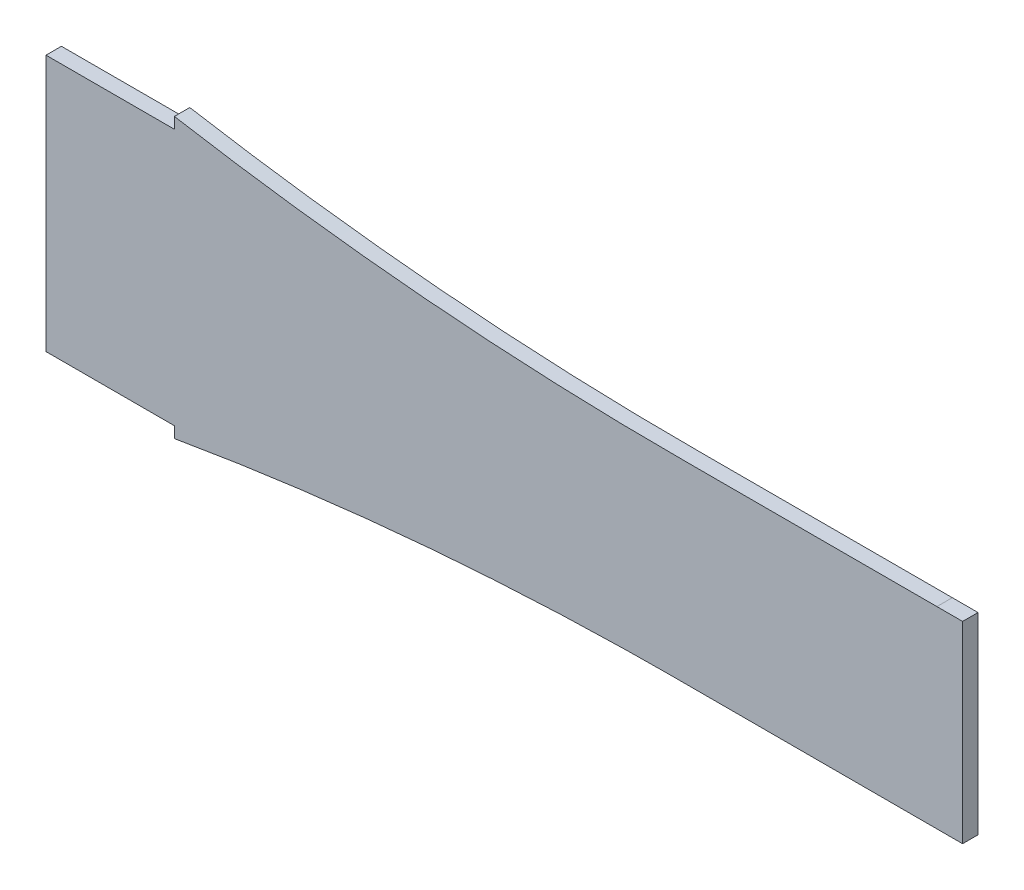
ISO-10303-21;
HEADER;
FILE_DESCRIPTION(('STEP AP214'),'2;1');
FILE_NAME('part.step','',(''),(''),'','','');
FILE_SCHEMA(('AUTOMOTIVE_DESIGN { 1 0 10303 214 1 1 1 1 }'));
ENDSEC;
DATA;
#1=APPLICATION_CONTEXT('core data for automotive mechanical design processes');
#2=APPLICATION_PROTOCOL_DEFINITION('international standard','automotive_design',2000,#1);
#3=PRODUCT_CONTEXT('',#1,'mechanical');
#4=PRODUCT('Part','Part','',(#3));
#5=PRODUCT_RELATED_PRODUCT_CATEGORY('part','',(#4));
#6=PRODUCT_DEFINITION_FORMATION('','',#4);
#7=PRODUCT_DEFINITION_CONTEXT('part definition',#1,'design');
#8=PRODUCT_DEFINITION('design','',#6,#7);
#9=PRODUCT_DEFINITION_SHAPE('','',#8);
#10=(LENGTH_UNIT() NAMED_UNIT(*) SI_UNIT(.MILLI.,.METRE.));
#11=(NAMED_UNIT(*) PLANE_ANGLE_UNIT() SI_UNIT($,.RADIAN.));
#12=(NAMED_UNIT(*) SI_UNIT($,.STERADIAN.) SOLID_ANGLE_UNIT());
#13=UNCERTAINTY_MEASURE_WITH_UNIT(LENGTH_MEASURE(1.E-05),#10,'distance_accuracy_value','');
#14=(GEOMETRIC_REPRESENTATION_CONTEXT(3) GLOBAL_UNCERTAINTY_ASSIGNED_CONTEXT((#13)) GLOBAL_UNIT_ASSIGNED_CONTEXT((#10,
#11,#12)) REPRESENTATION_CONTEXT('',''));
#15=CARTESIAN_POINT('',(0.,0.,0.));
#16=DIRECTION('',(0.,0.,1.));
#17=DIRECTION('',(1.,0.,0.));
#18=AXIS2_PLACEMENT_3D('',#15,#16,#17);
#19=CARTESIAN_POINT('',(141.101357242702,0.,-0.6));
#20=DIRECTION('',(1.,0.,0.));
#21=DIRECTION('',(0.,0.,-1.));
#22=AXIS2_PLACEMENT_3D('',#19,#20,#21);
#23=PLANE('',#22);
#24=DIRECTION('',(0.,0.,1.));
#25=VECTOR('',#24,1.);
#26=CARTESIAN_POINT('',(141.101357242702,-4.86658289994277,-0.6));
#27=LINE('',#26,#25);
#28=CARTESIAN_POINT('',(141.101357242702,-4.86658289994277,-0.6));
#29=VERTEX_POINT('',#28);
#30=CARTESIAN_POINT('',(141.101357242702,-4.86658289994277,0.6));
#31=VERTEX_POINT('',#30);
#32=EDGE_CURVE('E39',#29,#31,#27,.T.);
#33=ORIENTED_EDGE('',*,*,#32,.T.);
#34=DIRECTION('',(0.,1.,0.));
#35=VECTOR('',#34,1.);
#36=CARTESIAN_POINT('',(141.101357242702,0.,0.6));
#37=LINE('',#36,#35);
#38=CARTESIAN_POINT('',(141.101357242702,-4.00000000000001,0.6));
#39=VERTEX_POINT('',#38);
#40=EDGE_CURVE('E116',#31,#39,#37,.T.);
#41=ORIENTED_EDGE('',*,*,#40,.T.);
#42=DIRECTION('',(0.,0.,1.));
#43=VECTOR('',#42,1.);
#44=CARTESIAN_POINT('',(141.101357242702,-4.00000000000001,-0.6));
#45=LINE('',#44,#43);
#46=CARTESIAN_POINT('',(141.101357242702,-4.00000000000001,-0.6));
#47=VERTEX_POINT('',#46);
#48=EDGE_CURVE('E11',#47,#39,#45,.T.);
#49=ORIENTED_EDGE('',*,*,#48,.F.);
#50=DIRECTION('',(0.,1.,0.));
#51=VECTOR('',#50,1.);
#52=CARTESIAN_POINT('',(141.101357242702,0.,-0.6));
#53=LINE('',#52,#51);
#54=EDGE_CURVE('E52',#29,#47,#53,.T.);
#55=ORIENTED_EDGE('',*,*,#54,.F.);
#56=EDGE_LOOP('',(#33,#41,#49,#55));
#57=FACE_BOUND('',#56,.T.);
#58=ADVANCED_FACE('F34',(#57),#23,.F.);
#59=CARTESIAN_POINT('',(0.,-4.,-0.6));
#60=DIRECTION('',(0.,-1.,0.));
#61=DIRECTION('',(1.,0.,0.));
#62=AXIS2_PLACEMENT_3D('',#59,#60,#61);
#63=PLANE('',#62);
#64=ORIENTED_EDGE('',*,*,#48,.T.);
#65=DIRECTION('',(1.,0.,0.));
#66=VECTOR('',#65,1.);
#67=CARTESIAN_POINT('',(0.,-4.,0.6));
#68=LINE('',#67,#66);
#69=CARTESIAN_POINT('',(131.101357242702,-4.00000000000001,0.6));
#70=VERTEX_POINT('',#69);
#71=EDGE_CURVE('E132',#70,#39,#68,.T.);
#72=ORIENTED_EDGE('',*,*,#71,.F.);
#73=DIRECTION('',(0.,0.,1.));
#74=VECTOR('',#73,1.);
#75=CARTESIAN_POINT('',(131.101357242702,-4.00000000000001,-0.6));
#76=LINE('',#75,#74);
#77=CARTESIAN_POINT('',(131.101357242702,-4.00000000000001,-0.6));
#78=VERTEX_POINT('',#77);
#79=EDGE_CURVE('E44',#78,#70,#76,.T.);
#80=ORIENTED_EDGE('',*,*,#79,.F.);
#81=DIRECTION('',(1.,0.,0.));
#82=VECTOR('',#81,1.);
#83=CARTESIAN_POINT('',(0.,-4.,-0.6));
#84=LINE('',#83,#82);
#85=EDGE_CURVE('E120',#78,#47,#84,.T.);
#86=ORIENTED_EDGE('',*,*,#85,.T.);
#87=EDGE_LOOP('',(#64,#72,#80,#86));
#88=FACE_BOUND('',#87,.T.);
#89=ADVANCED_FACE('F211',(#88),#63,.T.);
#90=CARTESIAN_POINT('',(131.101357242702,0.,-0.6));
#91=DIRECTION('',(1.,0.,0.));
#92=DIRECTION('',(0.,0.,-1.));
#93=AXIS2_PLACEMENT_3D('',#90,#91,#92);
#94=PLANE('',#93);
#95=ORIENTED_EDGE('',*,*,#79,.T.);
#96=DIRECTION('',(0.,1.,0.));
#97=VECTOR('',#96,1.);
#98=CARTESIAN_POINT('',(131.101357242702,0.,0.6));
#99=LINE('',#98,#97);
#100=CARTESIAN_POINT('',(131.101357242702,16.,0.6));
#101=VERTEX_POINT('',#100);
#102=EDGE_CURVE('E142',#70,#101,#99,.T.);
#103=ORIENTED_EDGE('',*,*,#102,.T.);
#104=DIRECTION('',(0.,0.,1.));
#105=VECTOR('',#104,1.);
#106=CARTESIAN_POINT('',(131.101357242702,16.,-0.6));
#107=LINE('',#106,#105);
#108=CARTESIAN_POINT('',(131.101357242702,16.,-0.6));
#109=VERTEX_POINT('',#108);
#110=EDGE_CURVE('E227',#109,#101,#107,.T.);
#111=ORIENTED_EDGE('',*,*,#110,.F.);
#112=DIRECTION('',(0.,1.,0.));
#113=VECTOR('',#112,1.);
#114=CARTESIAN_POINT('',(131.101357242702,0.,-0.6));
#115=LINE('',#114,#113);
#116=EDGE_CURVE('E256',#78,#109,#115,.T.);
#117=ORIENTED_EDGE('',*,*,#116,.F.);
#118=EDGE_LOOP('',(#95,#103,#111,#117));
#119=FACE_BOUND('',#118,.T.);
#120=ADVANCED_FACE('F215',(#119),#94,.F.);
#121=CARTESIAN_POINT('',(0.,16.0000000000001,-0.6));
#122=DIRECTION('',(0.,-1.,0.));
#123=DIRECTION('',(1.,0.,0.));
#124=AXIS2_PLACEMENT_3D('',#121,#122,#123);
#125=PLANE('',#124);
#126=ORIENTED_EDGE('',*,*,#110,.T.);
#127=DIRECTION('',(1.,0.,0.));
#128=VECTOR('',#127,1.);
#129=CARTESIAN_POINT('',(0.,16.0000000000001,0.6));
#130=LINE('',#129,#128);
#131=CARTESIAN_POINT('',(141.101357242702,16.,0.6));
#132=VERTEX_POINT('',#131);
#133=EDGE_CURVE('E136',#101,#132,#130,.T.);
#134=ORIENTED_EDGE('',*,*,#133,.T.);
#135=DIRECTION('',(0.,0.,1.));
#136=VECTOR('',#135,1.);
#137=CARTESIAN_POINT('',(141.101357242702,16.,-0.6));
#138=LINE('',#137,#136);
#139=CARTESIAN_POINT('',(141.101357242702,16.,-0.6));
#140=VERTEX_POINT('',#139);
#141=EDGE_CURVE('E225',#140,#132,#138,.T.);
#142=ORIENTED_EDGE('',*,*,#141,.F.);
#143=DIRECTION('',(1.,0.,0.));
#144=VECTOR('',#143,1.);
#145=CARTESIAN_POINT('',(0.,16.0000000000001,-0.6));
#146=LINE('',#145,#144);
#147=EDGE_CURVE('E183',#109,#140,#146,.T.);
#148=ORIENTED_EDGE('',*,*,#147,.F.);
#149=EDGE_LOOP('',(#126,#134,#142,#148));
#150=FACE_BOUND('',#149,.T.);
#151=ADVANCED_FACE('F218',(#150),#125,.F.);
#152=ORIENTED_EDGE('',*,*,#141,.T.);
#153=CARTESIAN_POINT('',(141.101357242702,16.8665829030283,0.6));
#154=VERTEX_POINT('',#153);
#155=EDGE_CURVE('E134',#132,#154,#37,.T.);
#156=ORIENTED_EDGE('',*,*,#155,.T.);
#157=DIRECTION('',(0.,0.,1.));
#158=VECTOR('',#157,1.);
#159=CARTESIAN_POINT('',(141.101357242702,16.8665829030283,-0.6));
#160=LINE('',#159,#158);
#161=CARTESIAN_POINT('',(141.101357242702,16.8665829030283,-0.6));
#162=VERTEX_POINT('',#161);
#163=EDGE_CURVE('E228',#162,#154,#160,.T.);
#164=ORIENTED_EDGE('',*,*,#163,.F.);
#165=EDGE_CURVE('E163',#140,#162,#53,.T.);
#166=ORIENTED_EDGE('',*,*,#165,.F.);
#167=EDGE_LOOP('',(#152,#156,#164,#166));
#168=FACE_BOUND('',#167,.T.);
#169=ADVANCED_FACE('F194',(#168),#23,.F.);
#170=CARTESIAN_POINT('',(200.50370257032,13.5,-0.6));
#171=CARTESIAN_POINT('',(199.074917607863,13.5,-0.6));
#172=CARTESIAN_POINT('',(196.922682113011,13.4999999880973,-0.6));
#173=CARTESIAN_POINT('',(194.089266991205,13.5000000198378,-0.6));
#174=CARTESIAN_POINT('',(191.634138001622,13.4999999246163,-0.6));
#175=CARTESIAN_POINT('',(189.047662173666,13.5000002816969,-0.6));
#176=CARTESIAN_POINT('',(185.720042456999,13.4999985042292,-0.6));
#177=CARTESIAN_POINT('',(183.067579699138,13.5000093436081,-0.6));
#178=CARTESIAN_POINT('',(180.929013683632,13.4999840226286,-0.6));
#179=CARTESIAN_POINT('',(179.048732059276,13.5000865206204,-0.6));
#180=CARTESIAN_POINT('',(176.736526724022,13.5231044209523,-0.6));
#181=CARTESIAN_POINT('',(174.091882285485,13.5803475263092,-0.6));
#182=CARTESIAN_POINT('',(171.527736211095,13.6658215283123,-0.6));
#183=CARTESIAN_POINT('',(169.025206506323,13.7762859464122,-0.6));
#184=CARTESIAN_POINT('',(165.740597936394,13.9551698057802,-0.6));
#185=CARTESIAN_POINT('',(161.709086389879,14.2398546582152,-0.6));
#186=CARTESIAN_POINT('',(156.900354591833,14.6803919269567,-0.6));
#187=CARTESIAN_POINT('',(152.026473921235,15.2320423252698,-0.6));
#188=CARTESIAN_POINT('',(147.014900529943,15.9033837676482,-0.6));
#189=CARTESIAN_POINT('',(141.648285626768,16.7493721624977,-0.6));
#190=CARTESIAN_POINT('',(135.852117078069,17.8087694831889,-0.6));
#191=CARTESIAN_POINT('',(127.954832765805,19.4662144414581,-0.6));
#192=CARTESIAN_POINT('',(117.662597645174,22.0526471758129,-0.6));
#193=CARTESIAN_POINT('',(105.095697041218,25.988020630968,-0.6));
#194=CARTESIAN_POINT('',(94.8315928138357,29.8422023096934,-0.6));
#195=CARTESIAN_POINT('',(87.0594711772737,33.1900131616436,-0.6));
#196=CARTESIAN_POINT('',(79.3240610108562,36.4197847788014,-0.6));
#197=CARTESIAN_POINT('',(69.5591399402608,40.2855929965504,-0.6));
#198=CARTESIAN_POINT('',(57.6651955167104,44.6374779961789,-0.6));
#199=CARTESIAN_POINT('',(45.6694197162006,48.6476407813243,-0.6));
#200=CARTESIAN_POINT('',(29.5187149632974,53.5135271149481,-0.6));
#201=CARTESIAN_POINT('',(9.05694216564289,58.6198395024492,-0.6));
#202=CARTESIAN_POINT('',(-15.8792995780897,62.9176069243505,-0.6));
#203=CARTESIAN_POINT('',(-41.0871610835406,65.0643210620624,-0.6));
#204=CARTESIAN_POINT('',(-66.3794591406682,64.680911269362,-0.6));
#205=CARTESIAN_POINT('',(-91.4465280842014,61.3301117669268,-0.6));
#206=CARTESIAN_POINT('',(-111.745791670528,55.6594945291713,-0.6));
#207=CARTESIAN_POINT('',(-127.235680387522,49.126071695585,-0.6));
#208=CARTESIAN_POINT('',(-138.327528426005,43.1510553943047,-0.6));
#209=CARTESIAN_POINT('',(-148.698447894915,36.0118180282978,-0.6));
#210=CARTESIAN_POINT('',(-158.027199119519,27.5945918197225,-0.6));
#211=CARTESIAN_POINT('',(-164.496183458254,19.3622606803757,-0.6));
#212=CARTESIAN_POINT('',(-167.653921417957,12.8663282133976,-0.6));
#213=CARTESIAN_POINT('',(-168.768877649743,8.95280335393217,-0.6));
#214=CARTESIAN_POINT('',(-169.,6.98920546303122,-0.6));
#215=CARTESIAN_POINT('',(-169.,6.,-0.6));
#216=B_SPLINE_CURVE_WITH_KNOTS('',3,(#170,#171,#172,#173,#174,#175,#176,#177,#178,#179,#180,
#181,#182,#183,#184,#185,#186,#187,#188,#189,#190,#191,#192,#193,#194,#195,#196,#197,#198,#199,
#200,#201,#202,#203,#204,#205,#206,#207,#208,#209,#210,#211,#212,#213,#214,#215),.UNSPECIFIED.,
.F.,.F.,(4,1,1,1,1,1,1,1,1,1,1,1,1,1,1,1,1,1,1,1,1,1,1,1,1,1,1,1,1,1,1,1,1,1,1,1,1,1,1,1,1,1,1,
4),(0.0164132330588846,0.0240975046756121,0.0279396404839758,0.0317817762923395,
0.0356239121007033,0.039466047909067,0.0471503195257945,0.0509924553341582,0.0548345911425219,
0.0625188627592494,0.0702031343759769,0.0778874059927043,0.0855716776094318,0.0932559492261593,
0.108624492459614,0.123993035693069,0.139361578926524,0.154730122159979,0.170098665393434,
0.185467208626889,0.200835751860344,0.231572838327254,0.262309924794163,0.293047011261073,
0.308415554494528,0.323784097727983,0.354521184194893,0.385258270661803,0.415995357128713,
0.446732443595623,0.508206616529442,0.569680789463262,0.631154962397082,0.692629135330902,
0.754103308264721,0.815577481198541,0.846314567665451,0.877051654132361,0.90778874059927,
0.93852582706618,0.96926291353309,0.984631456766545,0.992315728383273,1.),.UNSPECIFIED.);
#217=DIRECTION('',(0.,0.,1.));
#218=VECTOR('',#217,1.);
#219=SURFACE_OF_LINEAR_EXTRUSION('',#216,#218);
#220=ORIENTED_EDGE('',*,*,#163,.T.);
#221=CARTESIAN_POINT('',(200.50370257032,13.5,0.6));
#222=CARTESIAN_POINT('',(199.074917607863,13.5,0.6));
#223=CARTESIAN_POINT('',(196.922682113011,13.4999999880973,0.6));
#224=CARTESIAN_POINT('',(194.089266991205,13.5000000198378,0.6));
#225=CARTESIAN_POINT('',(191.634138001622,13.4999999246163,0.6));
#226=CARTESIAN_POINT('',(189.047662173666,13.5000002816969,0.6));
#227=CARTESIAN_POINT('',(185.720042456999,13.4999985042292,0.6));
#228=CARTESIAN_POINT('',(183.067579699138,13.5000093436081,0.6));
#229=CARTESIAN_POINT('',(180.929013683632,13.4999840226286,0.6));
#230=CARTESIAN_POINT('',(179.048732059276,13.5000865206204,0.6));
#231=CARTESIAN_POINT('',(176.736526724022,13.5231044209523,0.6));
#232=CARTESIAN_POINT('',(174.091882285485,13.5803475263092,0.6));
#233=CARTESIAN_POINT('',(171.527736211095,13.6658215283123,0.6));
#234=CARTESIAN_POINT('',(169.025206506323,13.7762859464122,0.6));
#235=CARTESIAN_POINT('',(165.740597936394,13.9551698057802,0.6));
#236=CARTESIAN_POINT('',(161.709086389879,14.2398546582152,0.6));
#237=CARTESIAN_POINT('',(156.900354591833,14.6803919269567,0.6));
#238=CARTESIAN_POINT('',(152.026473921235,15.2320423252698,0.6));
#239=CARTESIAN_POINT('',(147.014900529943,15.9033837676482,0.6));
#240=CARTESIAN_POINT('',(141.648285626768,16.7493721624977,0.6));
#241=CARTESIAN_POINT('',(135.852117078069,17.8087694831889,0.6));
#242=CARTESIAN_POINT('',(127.954832765805,19.4662144414581,0.6));
#243=CARTESIAN_POINT('',(117.662597645174,22.0526471758129,0.6));
#244=CARTESIAN_POINT('',(105.095697041218,25.988020630968,0.6));
#245=CARTESIAN_POINT('',(94.8315928138357,29.8422023096934,0.6));
#246=CARTESIAN_POINT('',(87.0594711772737,33.1900131616436,0.6));
#247=CARTESIAN_POINT('',(79.3240610108562,36.4197847788014,0.6));
#248=CARTESIAN_POINT('',(69.5591399402608,40.2855929965504,0.6));
#249=CARTESIAN_POINT('',(57.6651955167104,44.6374779961789,0.6));
#250=CARTESIAN_POINT('',(45.6694197162006,48.6476407813243,0.6));
#251=CARTESIAN_POINT('',(29.5187149632974,53.5135271149481,0.6));
#252=CARTESIAN_POINT('',(9.05694216564289,58.6198395024492,0.6));
#253=CARTESIAN_POINT('',(-15.8792995780897,62.9176069243505,0.6));
#254=CARTESIAN_POINT('',(-41.0871610835406,65.0643210620624,0.6));
#255=CARTESIAN_POINT('',(-66.3794591406682,64.680911269362,0.6));
#256=CARTESIAN_POINT('',(-91.4465280842014,61.3301117669268,0.6));
#257=CARTESIAN_POINT('',(-111.745791670528,55.6594945291713,0.6));
#258=CARTESIAN_POINT('',(-127.235680387522,49.126071695585,0.6));
#259=CARTESIAN_POINT('',(-138.327528426005,43.1510553943047,0.6));
#260=CARTESIAN_POINT('',(-148.698447894915,36.0118180282978,0.6));
#261=CARTESIAN_POINT('',(-158.027199119519,27.5945918197225,0.6));
#262=CARTESIAN_POINT('',(-164.496183458254,19.3622606803757,0.6));
#263=CARTESIAN_POINT('',(-167.653921417957,12.8663282133976,0.6));
#264=CARTESIAN_POINT('',(-168.768877649743,8.95280335393217,0.6));
#265=CARTESIAN_POINT('',(-169.,6.98920546303122,0.6));
#266=CARTESIAN_POINT('',(-169.,6.,0.6));
#267=B_SPLINE_CURVE_WITH_KNOTS('',3,(#221,#222,#223,#224,#225,#226,#227,#228,#229,#230,#231,
#232,#233,#234,#235,#236,#237,#238,#239,#240,#241,#242,#243,#244,#245,#246,#247,#248,#249,#250,
#251,#252,#253,#254,#255,#256,#257,#258,#259,#260,#261,#262,#263,#264,#265,#266),.UNSPECIFIED.,
.F.,.F.,(4,1,1,1,1,1,1,1,1,1,1,1,1,1,1,1,1,1,1,1,1,1,1,1,1,1,1,1,1,1,1,1,1,1,1,1,1,1,1,1,1,1,1,
4),(0.0164132330588846,0.0240975046756121,0.0279396404839758,0.0317817762923395,
0.0356239121007033,0.039466047909067,0.0471503195257945,0.0509924553341582,0.0548345911425219,
0.0625188627592494,0.0702031343759769,0.0778874059927043,0.0855716776094318,0.0932559492261593,
0.108624492459614,0.123993035693069,0.139361578926524,0.154730122159979,0.170098665393434,
0.185467208626889,0.200835751860344,0.231572838327254,0.262309924794163,0.293047011261073,
0.308415554494528,0.323784097727983,0.354521184194893,0.385258270661803,0.415995357128713,
0.446732443595623,0.508206616529442,0.569680789463262,0.631154962397082,0.692629135330902,
0.754103308264721,0.815577481198541,0.846314567665451,0.877051654132361,0.90778874059927,
0.93852582706618,0.96926291353309,0.984631456766545,0.992315728383273,1.),.UNSPECIFIED.);
#268=CARTESIAN_POINT('',(200.50370257032,13.5,0.6));
#269=VERTEX_POINT('',#268);
#270=EDGE_CURVE('E137',#269,#154,#267,.T.);
#271=ORIENTED_EDGE('',*,*,#270,.F.);
#272=DIRECTION('',(0.,0.,1.));
#273=VECTOR('',#272,1.);
#274=CARTESIAN_POINT('',(200.50370257032,13.5,-0.6));
#275=LINE('',#274,#273);
#276=CARTESIAN_POINT('',(200.50370257032,13.5,-0.6));
#277=VERTEX_POINT('',#276);
#278=EDGE_CURVE('E237',#277,#269,#275,.T.);
#279=ORIENTED_EDGE('',*,*,#278,.F.);
#280=EDGE_CURVE('E177',#277,#162,#216,.T.);
#281=ORIENTED_EDGE('',*,*,#280,.T.);
#282=EDGE_LOOP('',(#220,#271,#279,#281));
#283=FACE_BOUND('',#282,.T.);
#284=ADVANCED_FACE('F189',(#283),#219,.T.);
#285=CARTESIAN_POINT('',(0.,13.5,-0.6));
#286=DIRECTION('',(0.,-1.,0.));
#287=DIRECTION('',(0.,0.,-1.));
#288=AXIS2_PLACEMENT_3D('',#285,#286,#287);
#289=PLANE('',#288);
#290=ORIENTED_EDGE('',*,*,#278,.T.);
#291=DIRECTION('',(1.,0.,0.));
#292=VECTOR('',#291,1.);
#293=CARTESIAN_POINT('',(0.,13.5,0.6));
#294=LINE('',#293,#292);
#295=CARTESIAN_POINT('',(202.503702570323,13.5,0.6));
#296=VERTEX_POINT('',#295);
#297=EDGE_CURVE('E145',#269,#296,#294,.T.);
#298=ORIENTED_EDGE('',*,*,#297,.T.);
#299=DIRECTION('',(0.,0.,1.));
#300=VECTOR('',#299,1.);
#301=CARTESIAN_POINT('',(202.503702570323,13.5,-0.6));
#302=LINE('',#301,#300);
#303=CARTESIAN_POINT('',(202.503702570323,13.5,-0.6));
#304=VERTEX_POINT('',#303);
#305=EDGE_CURVE('E239',#304,#296,#302,.T.);
#306=ORIENTED_EDGE('',*,*,#305,.F.);
#307=DIRECTION('',(1.,0.,0.));
#308=VECTOR('',#307,1.);
#309=CARTESIAN_POINT('',(0.,13.5,-0.6));
#310=LINE('',#309,#308);
#311=EDGE_CURVE('E175',#277,#304,#310,.T.);
#312=ORIENTED_EDGE('',*,*,#311,.F.);
#313=EDGE_LOOP('',(#290,#298,#306,#312));
#314=FACE_BOUND('',#313,.T.);
#315=ADVANCED_FACE('F193',(#314),#289,.F.);
#316=CARTESIAN_POINT('',(202.503702570323,0.,-0.6));
#317=DIRECTION('',(-1.,0.,0.));
#318=DIRECTION('',(0.,0.,1.));
#319=AXIS2_PLACEMENT_3D('',#316,#317,#318);
#320=PLANE('',#319);
#321=ORIENTED_EDGE('',*,*,#305,.T.);
#322=DIRECTION('',(0.,-1.,0.));
#323=VECTOR('',#322,1.);
#324=CARTESIAN_POINT('',(202.503702570323,0.,0.6));
#325=LINE('',#324,#323);
#326=CARTESIAN_POINT('',(202.503702570323,-1.5,0.6));
#327=VERTEX_POINT('',#326);
#328=EDGE_CURVE('E150',#296,#327,#325,.T.);
#329=ORIENTED_EDGE('',*,*,#328,.T.);
#330=DIRECTION('',(0.,0.,1.));
#331=VECTOR('',#330,1.);
#332=CARTESIAN_POINT('',(202.503702570323,-1.5,-0.6));
#333=LINE('',#332,#331);
#334=CARTESIAN_POINT('',(202.503702570323,-1.5,-0.6));
#335=VERTEX_POINT('',#334);
#336=EDGE_CURVE('E241',#335,#327,#333,.T.);
#337=ORIENTED_EDGE('',*,*,#336,.F.);
#338=DIRECTION('',(0.,-1.,0.));
#339=VECTOR('',#338,1.);
#340=CARTESIAN_POINT('',(202.503702570323,0.,-0.6));
#341=LINE('',#340,#339);
#342=EDGE_CURVE('E173',#304,#335,#341,.T.);
#343=ORIENTED_EDGE('',*,*,#342,.F.);
#344=EDGE_LOOP('',(#321,#329,#337,#343));
#345=FACE_BOUND('',#344,.T.);
#346=ADVANCED_FACE('F199',(#345),#320,.F.);
#347=CARTESIAN_POINT('',(0.,-1.50000000000003,-0.6));
#348=DIRECTION('',(0.,1.,0.));
#349=DIRECTION('',(-1.,0.,0.));
#350=AXIS2_PLACEMENT_3D('',#347,#348,#349);
#351=PLANE('',#350);
#352=ORIENTED_EDGE('',*,*,#336,.T.);
#353=DIRECTION('',(-1.,0.,0.));
#354=VECTOR('',#353,1.);
#355=CARTESIAN_POINT('',(0.,-1.50000000000003,0.6));
#356=LINE('',#355,#354);
#357=CARTESIAN_POINT('',(200.50370257032,-1.5,0.6));
#358=VERTEX_POINT('',#357);
#359=EDGE_CURVE('E127',#327,#358,#356,.T.);
#360=ORIENTED_EDGE('',*,*,#359,.T.);
#361=DIRECTION('',(0.,0.,1.));
#362=VECTOR('',#361,1.);
#363=CARTESIAN_POINT('',(200.50370257032,-1.5,-0.6));
#364=LINE('',#363,#362);
#365=CARTESIAN_POINT('',(200.50370257032,-1.5,-0.6));
#366=VERTEX_POINT('',#365);
#367=EDGE_CURVE('E119',#366,#358,#364,.T.);
#368=ORIENTED_EDGE('',*,*,#367,.F.);
#369=DIRECTION('',(-1.,0.,0.));
#370=VECTOR('',#369,1.);
#371=CARTESIAN_POINT('',(0.,-1.50000000000003,-0.6));
#372=LINE('',#371,#370);
#373=EDGE_CURVE('E168',#335,#366,#372,.T.);
#374=ORIENTED_EDGE('',*,*,#373,.F.);
#375=EDGE_LOOP('',(#352,#360,#368,#374));
#376=FACE_BOUND('',#375,.T.);
#377=ADVANCED_FACE('F202',(#376),#351,.F.);
#378=CARTESIAN_POINT('',(-169.,6.,-0.6));
#379=CARTESIAN_POINT('',(-169.,5.01079453696878,-0.6));
#380=CARTESIAN_POINT('',(-168.768877649743,3.04719664606784,-0.6));
#381=CARTESIAN_POINT('',(-167.653921417957,-0.866328213397601,-0.6));
#382=CARTESIAN_POINT('',(-164.496183458254,-7.36226068037572,-0.6));
#383=CARTESIAN_POINT('',(-158.027199119519,-15.5945918197225,-0.6));
#384=CARTESIAN_POINT('',(-148.698447894915,-24.0118180282978,-0.6));
#385=CARTESIAN_POINT('',(-138.327528426005,-31.1510553943047,-0.6));
#386=CARTESIAN_POINT('',(-127.235680387522,-37.126071695585,-0.6));
#387=CARTESIAN_POINT('',(-111.745791670528,-43.6594945291714,-0.6));
#388=CARTESIAN_POINT('',(-91.4465280842014,-49.3301117669268,-0.6));
#389=CARTESIAN_POINT('',(-66.3794591406681,-52.6809112693619,-0.6));
#390=CARTESIAN_POINT('',(-41.0871610835405,-53.0643210620624,-0.6));
#391=CARTESIAN_POINT('',(-15.8792995780896,-50.9176069243505,-0.6));
#392=CARTESIAN_POINT('',(9.05694216564298,-46.6198395024491,-0.6));
#393=CARTESIAN_POINT('',(29.5187149632975,-41.513527114948,-0.6));
#394=CARTESIAN_POINT('',(45.6694197162006,-36.6476407813242,-0.6));
#395=CARTESIAN_POINT('',(57.6651955167106,-32.6374779961789,-0.6));
#396=CARTESIAN_POINT('',(69.5591399402609,-28.2855929965504,-0.6));
#397=CARTESIAN_POINT('',(79.3240610108563,-24.4197847788014,-0.6));
#398=CARTESIAN_POINT('',(87.0594711772738,-21.1900131616435,-0.6));
#399=CARTESIAN_POINT('',(94.8315928138358,-17.8422023096933,-0.6));
#400=CARTESIAN_POINT('',(105.095697041218,-13.988020630968,-0.6));
#401=CARTESIAN_POINT('',(117.662597645174,-10.0526471758128,-0.6));
#402=CARTESIAN_POINT('',(127.954832765805,-7.46621444145812,-0.6));
#403=CARTESIAN_POINT('',(135.852117078069,-5.80876948318885,-0.6));
#404=CARTESIAN_POINT('',(141.648285626768,-4.74937216249769,-0.6));
#405=CARTESIAN_POINT('',(147.014900529943,-3.9033837676482,-0.6));
#406=CARTESIAN_POINT('',(152.026473921235,-3.23204232526977,-0.6));
#407=CARTESIAN_POINT('',(156.900354591833,-2.68039192695673,-0.6));
#408=CARTESIAN_POINT('',(161.709086389879,-2.23985465821516,-0.6));
#409=CARTESIAN_POINT('',(165.740597936394,-1.95516980578024,-0.6));
#410=CARTESIAN_POINT('',(169.025206506323,-1.77628594641217,-0.6));
#411=CARTESIAN_POINT('',(171.527736211095,-1.66582152831232,-0.6));
#412=CARTESIAN_POINT('',(174.091882285485,-1.58034752630916,-0.6));
#413=CARTESIAN_POINT('',(176.736526724022,-1.52310442095234,-0.6));
#414=CARTESIAN_POINT('',(179.048732059276,-1.50008652062038,-0.6));
#415=CARTESIAN_POINT('',(180.929013683632,-1.4999840226286,-0.6));
#416=CARTESIAN_POINT('',(183.067579699139,-1.50000934360807,-0.6));
#417=CARTESIAN_POINT('',(185.720042456999,-1.49999850422921,-0.6));
#418=CARTESIAN_POINT('',(189.047662173666,-1.50000028169689,-0.6));
#419=CARTESIAN_POINT('',(191.634138001622,-1.49999992461633,-0.6));
#420=CARTESIAN_POINT('',(194.089266991205,-1.50000001983781,-0.6));
#421=CARTESIAN_POINT('',(196.922682113011,-1.49999998809732,-0.6));
#422=CARTESIAN_POINT('',(199.074917607863,-1.49999999999999,-0.6));
#423=CARTESIAN_POINT('',(200.50370257032,-1.5,-0.6));
#424=B_SPLINE_CURVE_WITH_KNOTS('',3,(#378,#379,#380,#381,#382,#383,#384,#385,#386,#387,#388,
#389,#390,#391,#392,#393,#394,#395,#396,#397,#398,#399,#400,#401,#402,#403,#404,#405,#406,#407,
#408,#409,#410,#411,#412,#413,#414,#415,#416,#417,#418,#419,#420,#421,#422,#423),.UNSPECIFIED.,
.F.,.F.,(4,1,1,1,1,1,1,1,1,1,1,1,1,1,1,1,1,1,1,1,1,1,1,1,1,1,1,1,1,1,1,1,1,1,1,1,1,1,1,1,1,1,1,
4),(0.0164132330588842,0.0240975046756117,0.0317817762923391,0.0471503195257941,
0.0778874059927039,0.108624492459614,0.139361578926524,0.170098665393434,0.200835751860343,
0.262309924794163,0.323784097727983,0.385258270661803,0.446732443595622,0.508206616529442,
0.569680789463262,0.600417875930172,0.631154962397082,0.661892048863991,0.692629135330901,
0.707997678564356,0.723366221797811,0.754103308264721,0.784840394731631,0.815577481198541,
0.830946024431996,0.846314567665451,0.861683110898906,0.877051654132361,0.892420197365815,
0.90778874059927,0.923157283832725,0.930841555449453,0.93852582706618,0.946210098682908,
0.953894370299635,0.961578641916363,0.965420777724726,0.96926291353309,0.976947185149818,
0.980789320958181,0.984631456766545,0.988473592574909,0.992315728383273,1.),.UNSPECIFIED.);
#425=DIRECTION('',(0.,0.,1.));
#426=VECTOR('',#425,1.);
#427=SURFACE_OF_LINEAR_EXTRUSION('',#424,#426);
#428=ORIENTED_EDGE('',*,*,#367,.T.);
#429=CARTESIAN_POINT('',(-169.,6.,0.6));
#430=CARTESIAN_POINT('',(-169.,5.01079453696878,0.6));
#431=CARTESIAN_POINT('',(-168.768877649743,3.04719664606784,0.6));
#432=CARTESIAN_POINT('',(-167.653921417957,-0.866328213397601,0.6));
#433=CARTESIAN_POINT('',(-164.496183458254,-7.36226068037572,0.6));
#434=CARTESIAN_POINT('',(-158.027199119519,-15.5945918197225,0.6));
#435=CARTESIAN_POINT('',(-148.698447894915,-24.0118180282978,0.6));
#436=CARTESIAN_POINT('',(-138.327528426005,-31.1510553943047,0.6));
#437=CARTESIAN_POINT('',(-127.235680387522,-37.126071695585,0.6));
#438=CARTESIAN_POINT('',(-111.745791670528,-43.6594945291714,0.6));
#439=CARTESIAN_POINT('',(-91.4465280842014,-49.3301117669268,0.6));
#440=CARTESIAN_POINT('',(-66.3794591406681,-52.6809112693619,0.6));
#441=CARTESIAN_POINT('',(-41.0871610835405,-53.0643210620624,0.6));
#442=CARTESIAN_POINT('',(-15.8792995780896,-50.9176069243505,0.6));
#443=CARTESIAN_POINT('',(9.05694216564298,-46.6198395024491,0.6));
#444=CARTESIAN_POINT('',(29.5187149632975,-41.513527114948,0.6));
#445=CARTESIAN_POINT('',(45.6694197162006,-36.6476407813242,0.6));
#446=CARTESIAN_POINT('',(57.6651955167106,-32.6374779961789,0.6));
#447=CARTESIAN_POINT('',(69.5591399402609,-28.2855929965504,0.6));
#448=CARTESIAN_POINT('',(79.3240610108563,-24.4197847788014,0.6));
#449=CARTESIAN_POINT('',(87.0594711772738,-21.1900131616435,0.6));
#450=CARTESIAN_POINT('',(94.8315928138358,-17.8422023096933,0.6));
#451=CARTESIAN_POINT('',(105.095697041218,-13.988020630968,0.6));
#452=CARTESIAN_POINT('',(117.662597645174,-10.0526471758128,0.6));
#453=CARTESIAN_POINT('',(127.954832765805,-7.46621444145812,0.6));
#454=CARTESIAN_POINT('',(135.852117078069,-5.80876948318885,0.6));
#455=CARTESIAN_POINT('',(141.648285626768,-4.74937216249769,0.6));
#456=CARTESIAN_POINT('',(147.014900529943,-3.9033837676482,0.6));
#457=CARTESIAN_POINT('',(152.026473921235,-3.23204232526977,0.6));
#458=CARTESIAN_POINT('',(156.900354591833,-2.68039192695673,0.6));
#459=CARTESIAN_POINT('',(161.709086389879,-2.23985465821516,0.6));
#460=CARTESIAN_POINT('',(165.740597936394,-1.95516980578024,0.6));
#461=CARTESIAN_POINT('',(169.025206506323,-1.77628594641217,0.6));
#462=CARTESIAN_POINT('',(171.527736211095,-1.66582152831232,0.6));
#463=CARTESIAN_POINT('',(174.091882285485,-1.58034752630916,0.6));
#464=CARTESIAN_POINT('',(176.736526724022,-1.52310442095234,0.6));
#465=CARTESIAN_POINT('',(179.048732059276,-1.50008652062038,0.6));
#466=CARTESIAN_POINT('',(180.929013683632,-1.4999840226286,0.6));
#467=CARTESIAN_POINT('',(183.067579699139,-1.50000934360807,0.6));
#468=CARTESIAN_POINT('',(185.720042456999,-1.49999850422921,0.6));
#469=CARTESIAN_POINT('',(189.047662173666,-1.50000028169689,0.6));
#470=CARTESIAN_POINT('',(191.634138001622,-1.49999992461633,0.6));
#471=CARTESIAN_POINT('',(194.089266991205,-1.50000001983781,0.6));
#472=CARTESIAN_POINT('',(196.922682113011,-1.49999998809732,0.6));
#473=CARTESIAN_POINT('',(199.074917607863,-1.49999999999999,0.6));
#474=CARTESIAN_POINT('',(200.50370257032,-1.5,0.6));
#475=B_SPLINE_CURVE_WITH_KNOTS('',3,(#429,#430,#431,#432,#433,#434,#435,#436,#437,#438,#439,
#440,#441,#442,#443,#444,#445,#446,#447,#448,#449,#450,#451,#452,#453,#454,#455,#456,#457,#458,
#459,#460,#461,#462,#463,#464,#465,#466,#467,#468,#469,#470,#471,#472,#473,#474),.UNSPECIFIED.,
.F.,.F.,(4,1,1,1,1,1,1,1,1,1,1,1,1,1,1,1,1,1,1,1,1,1,1,1,1,1,1,1,1,1,1,1,1,1,1,1,1,1,1,1,1,1,1,
4),(0.0164132330588842,0.0240975046756117,0.0317817762923391,0.0471503195257941,
0.0778874059927039,0.108624492459614,0.139361578926524,0.170098665393434,0.200835751860343,
0.262309924794163,0.323784097727983,0.385258270661803,0.446732443595622,0.508206616529442,
0.569680789463262,0.600417875930172,0.631154962397082,0.661892048863991,0.692629135330901,
0.707997678564356,0.723366221797811,0.754103308264721,0.784840394731631,0.815577481198541,
0.830946024431996,0.846314567665451,0.861683110898906,0.877051654132361,0.892420197365815,
0.90778874059927,0.923157283832725,0.930841555449453,0.93852582706618,0.946210098682908,
0.953894370299635,0.961578641916363,0.965420777724726,0.96926291353309,0.976947185149818,
0.980789320958181,0.984631456766545,0.988473592574909,0.992315728383273,1.),.UNSPECIFIED.);
#476=EDGE_CURVE('E122',#31,#358,#475,.T.);
#477=ORIENTED_EDGE('',*,*,#476,.F.);
#478=ORIENTED_EDGE('',*,*,#32,.F.);
#479=EDGE_CURVE('E162',#29,#366,#424,.T.);
#480=ORIENTED_EDGE('',*,*,#479,.T.);
#481=EDGE_LOOP('',(#428,#477,#478,#480));
#482=FACE_BOUND('',#481,.T.);
#483=ADVANCED_FACE('F36',(#482),#427,.T.);
#484=CARTESIAN_POINT('',(0.,0.,-0.6));
#485=DIRECTION('',(0.,0.,1.));
#486=DIRECTION('',(1.,0.,0.));
#487=AXIS2_PLACEMENT_3D('',#484,#485,#486);
#488=PLANE('',#487);
#489=ORIENTED_EDGE('',*,*,#54,.T.);
#490=ORIENTED_EDGE('',*,*,#85,.F.);
#491=ORIENTED_EDGE('',*,*,#116,.T.);
#492=ORIENTED_EDGE('',*,*,#147,.T.);
#493=ORIENTED_EDGE('',*,*,#165,.T.);
#494=ORIENTED_EDGE('',*,*,#280,.F.);
#495=ORIENTED_EDGE('',*,*,#311,.T.);
#496=ORIENTED_EDGE('',*,*,#342,.T.);
#497=ORIENTED_EDGE('',*,*,#373,.T.);
#498=ORIENTED_EDGE('',*,*,#479,.F.);
#499=EDGE_LOOP('',(#489,#490,#491,#492,#493,#494,#495,#496,#497,#498));
#500=FACE_BOUND('',#499,.T.);
#501=ADVANCED_FACE('F209',(#500),#488,.F.);
#502=CARTESIAN_POINT('',(0.,0.,0.6));
#503=DIRECTION('',(0.,0.,1.));
#504=DIRECTION('',(1.,0.,0.));
#505=AXIS2_PLACEMENT_3D('',#502,#503,#504);
#506=PLANE('',#505);
#507=ORIENTED_EDGE('',*,*,#40,.F.);
#508=ORIENTED_EDGE('',*,*,#476,.T.);
#509=ORIENTED_EDGE('',*,*,#359,.F.);
#510=ORIENTED_EDGE('',*,*,#328,.F.);
#511=ORIENTED_EDGE('',*,*,#297,.F.);
#512=ORIENTED_EDGE('',*,*,#270,.T.);
#513=ORIENTED_EDGE('',*,*,#155,.F.);
#514=ORIENTED_EDGE('',*,*,#133,.F.);
#515=ORIENTED_EDGE('',*,*,#102,.F.);
#516=ORIENTED_EDGE('',*,*,#71,.T.);
#517=EDGE_LOOP('',(#507,#508,#509,#510,#511,#512,#513,#514,#515,#516));
#518=FACE_BOUND('',#517,.T.);
#519=ADVANCED_FACE('F130',(#518),#506,.T.);
#520=CLOSED_SHELL('',(#58,#89,#120,#151,#169,#284,#315,#346,#377,#483,#501,#519));
#521=MANIFOLD_SOLID_BREP('B2',#520);
#522=ADVANCED_BREP_SHAPE_REPRESENTATION('',(#18,#521),#14);
#523=SHAPE_DEFINITION_REPRESENTATION(#9,#522);
ENDSEC;
END-ISO-10303-21;
